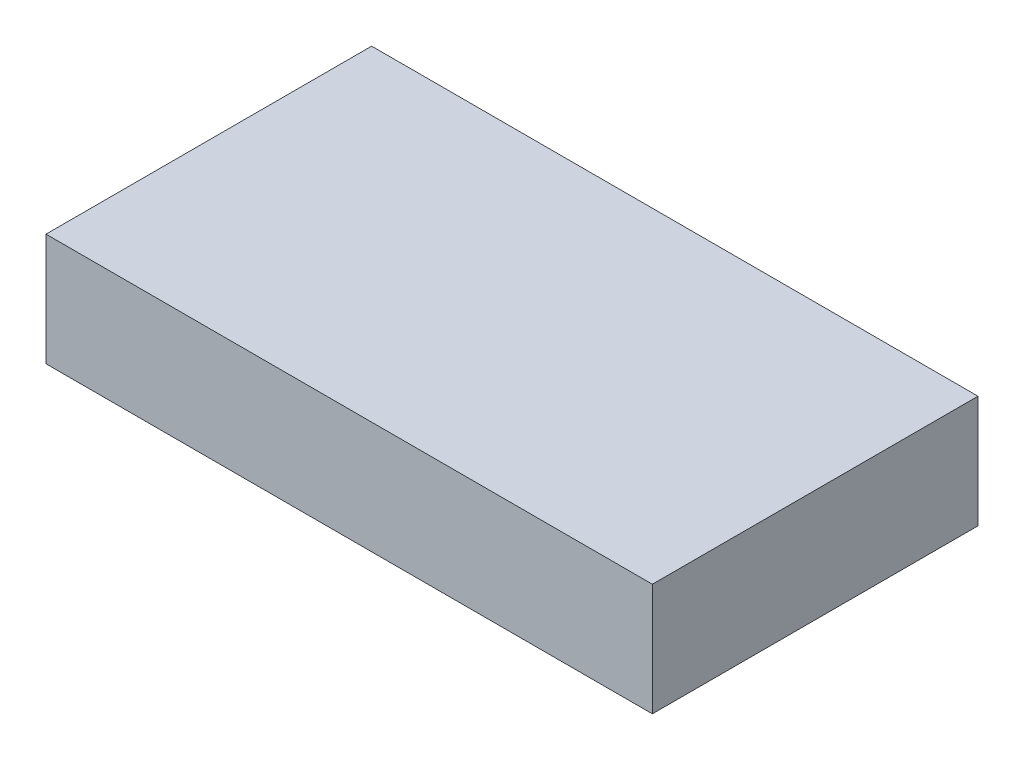
ISO-10303-21;
HEADER;
FILE_DESCRIPTION(('STEP AP214'),'2;1');
FILE_NAME('part.step','',(''),(''),'','','');
FILE_SCHEMA(('AUTOMOTIVE_DESIGN { 1 0 10303 214 1 1 1 1 }'));
ENDSEC;
DATA;
#1=APPLICATION_CONTEXT('core data for automotive mechanical design processes');
#2=APPLICATION_PROTOCOL_DEFINITION('international standard','automotive_design',2000,#1);
#3=PRODUCT_CONTEXT('',#1,'mechanical');
#4=PRODUCT('Part','Part','',(#3));
#5=PRODUCT_RELATED_PRODUCT_CATEGORY('part','',(#4));
#6=PRODUCT_DEFINITION_FORMATION('','',#4);
#7=PRODUCT_DEFINITION_CONTEXT('part definition',#1,'design');
#8=PRODUCT_DEFINITION('design','',#6,#7);
#9=PRODUCT_DEFINITION_SHAPE('','',#8);
#10=(LENGTH_UNIT() NAMED_UNIT(*) SI_UNIT(.MILLI.,.METRE.));
#11=(NAMED_UNIT(*) PLANE_ANGLE_UNIT() SI_UNIT($,.RADIAN.));
#12=(NAMED_UNIT(*) SI_UNIT($,.STERADIAN.) SOLID_ANGLE_UNIT());
#13=UNCERTAINTY_MEASURE_WITH_UNIT(LENGTH_MEASURE(1.E-05),#10,'distance_accuracy_value','');
#14=(GEOMETRIC_REPRESENTATION_CONTEXT(3) GLOBAL_UNCERTAINTY_ASSIGNED_CONTEXT((#13)) GLOBAL_UNIT_ASSIGNED_CONTEXT((#10,
#11,#12)) REPRESENTATION_CONTEXT('',''));
#15=CARTESIAN_POINT('',(0.,0.,0.));
#16=DIRECTION('',(0.,0.,1.));
#17=DIRECTION('',(1.,0.,0.));
#18=AXIS2_PLACEMENT_3D('',#15,#16,#17);
#19=CARTESIAN_POINT('',(27.,10.,-14.5));
#20=DIRECTION('',(-1.,0.,0.));
#21=DIRECTION('',(0.,0.,1.));
#22=AXIS2_PLACEMENT_3D('',#19,#20,#21);
#23=PLANE('',#22);
#24=DIRECTION('',(0.,0.,-1.));
#25=VECTOR('',#24,1.);
#26=CARTESIAN_POINT('',(27.,0.,-14.5));
#27=LINE('',#26,#25);
#28=CARTESIAN_POINT('',(27.,0.,14.5));
#29=VERTEX_POINT('',#28);
#30=CARTESIAN_POINT('',(27.,0.,-14.5));
#31=VERTEX_POINT('',#30);
#32=EDGE_CURVE('E100',#29,#31,#27,.T.);
#33=ORIENTED_EDGE('',*,*,#32,.T.);
#34=DIRECTION('',(0.,-1.,0.));
#35=VECTOR('',#34,1.);
#36=CARTESIAN_POINT('',(27.,10.,-14.5));
#37=LINE('',#36,#35);
#38=CARTESIAN_POINT('',(27.,10.,-14.5));
#39=VERTEX_POINT('',#38);
#40=EDGE_CURVE('E11',#39,#31,#37,.T.);
#41=ORIENTED_EDGE('',*,*,#40,.F.);
#42=DIRECTION('',(0.,0.,-1.));
#43=VECTOR('',#42,1.);
#44=CARTESIAN_POINT('',(27.,10.,-14.5));
#45=LINE('',#44,#43);
#46=CARTESIAN_POINT('',(27.,10.,14.5));
#47=VERTEX_POINT('',#46);
#48=EDGE_CURVE('E88',#47,#39,#45,.T.);
#49=ORIENTED_EDGE('',*,*,#48,.F.);
#50=DIRECTION('',(0.,-1.,0.));
#51=VECTOR('',#50,1.);
#52=CARTESIAN_POINT('',(27.,10.,14.5));
#53=LINE('',#52,#51);
#54=EDGE_CURVE('E96',#47,#29,#53,.T.);
#55=ORIENTED_EDGE('',*,*,#54,.T.);
#56=EDGE_LOOP('',(#33,#41,#49,#55));
#57=FACE_BOUND('',#56,.T.);
#58=ADVANCED_FACE('F37',(#57),#23,.F.);
#59=CARTESIAN_POINT('',(-27.,10.,-14.5));
#60=DIRECTION('',(0.,0.,1.));
#61=DIRECTION('',(1.,0.,0.));
#62=AXIS2_PLACEMENT_3D('',#59,#60,#61);
#63=PLANE('',#62);
#64=DIRECTION('',(-1.,0.,0.));
#65=VECTOR('',#64,1.);
#66=CARTESIAN_POINT('',(-27.,0.,-14.5));
#67=LINE('',#66,#65);
#68=CARTESIAN_POINT('',(-27.,0.,-14.5));
#69=VERTEX_POINT('',#68);
#70=EDGE_CURVE('E92',#31,#69,#67,.T.);
#71=ORIENTED_EDGE('',*,*,#70,.T.);
#72=DIRECTION('',(0.,-1.,0.));
#73=VECTOR('',#72,1.);
#74=CARTESIAN_POINT('',(-27.,10.,-14.5));
#75=LINE('',#74,#73);
#76=CARTESIAN_POINT('',(-27.,10.,-14.5));
#77=VERTEX_POINT('',#76);
#78=EDGE_CURVE('E45',#77,#69,#75,.T.);
#79=ORIENTED_EDGE('',*,*,#78,.F.);
#80=DIRECTION('',(-1.,0.,0.));
#81=VECTOR('',#80,1.);
#82=CARTESIAN_POINT('',(-27.,10.,-14.5));
#83=LINE('',#82,#81);
#84=EDGE_CURVE('E83',#39,#77,#83,.T.);
#85=ORIENTED_EDGE('',*,*,#84,.F.);
#86=ORIENTED_EDGE('',*,*,#40,.T.);
#87=EDGE_LOOP('',(#71,#79,#85,#86));
#88=FACE_BOUND('',#87,.T.);
#89=ADVANCED_FACE('F91',(#88),#63,.F.);
#90=CARTESIAN_POINT('',(-27.,10.,-14.5));
#91=DIRECTION('',(1.,0.,0.));
#92=DIRECTION('',(0.,0.,-1.));
#93=AXIS2_PLACEMENT_3D('',#90,#91,#92);
#94=PLANE('',#93);
#95=DIRECTION('',(0.,0.,1.));
#96=VECTOR('',#95,1.);
#97=CARTESIAN_POINT('',(-27.,0.,-14.5));
#98=LINE('',#97,#96);
#99=CARTESIAN_POINT('',(-27.,0.,14.5));
#100=VERTEX_POINT('',#99);
#101=EDGE_CURVE('E70',#69,#100,#98,.T.);
#102=ORIENTED_EDGE('',*,*,#101,.T.);
#103=DIRECTION('',(0.,-1.,0.));
#104=VECTOR('',#103,1.);
#105=CARTESIAN_POINT('',(-27.,10.,14.5));
#106=LINE('',#105,#104);
#107=CARTESIAN_POINT('',(-27.,10.,14.5));
#108=VERTEX_POINT('',#107);
#109=EDGE_CURVE('E93',#108,#100,#106,.T.);
#110=ORIENTED_EDGE('',*,*,#109,.F.);
#111=DIRECTION('',(0.,0.,1.));
#112=VECTOR('',#111,1.);
#113=CARTESIAN_POINT('',(-27.,10.,-14.5));
#114=LINE('',#113,#112);
#115=EDGE_CURVE('E86',#77,#108,#114,.T.);
#116=ORIENTED_EDGE('',*,*,#115,.F.);
#117=ORIENTED_EDGE('',*,*,#78,.T.);
#118=EDGE_LOOP('',(#102,#110,#116,#117));
#119=FACE_BOUND('',#118,.T.);
#120=ADVANCED_FACE('F94',(#119),#94,.F.);
#121=CARTESIAN_POINT('',(-27.,10.,14.5));
#122=DIRECTION('',(0.,0.,-1.));
#123=DIRECTION('',(-1.,0.,0.));
#124=AXIS2_PLACEMENT_3D('',#121,#122,#123);
#125=PLANE('',#124);
#126=DIRECTION('',(1.,0.,0.));
#127=VECTOR('',#126,1.);
#128=CARTESIAN_POINT('',(-27.,0.,14.5));
#129=LINE('',#128,#127);
#130=EDGE_CURVE('E76',#100,#29,#129,.T.);
#131=ORIENTED_EDGE('',*,*,#130,.T.);
#132=ORIENTED_EDGE('',*,*,#54,.F.);
#133=DIRECTION('',(1.,0.,0.));
#134=VECTOR('',#133,1.);
#135=CARTESIAN_POINT('',(-27.,10.,14.5));
#136=LINE('',#135,#134);
#137=EDGE_CURVE('E53',#108,#47,#136,.T.);
#138=ORIENTED_EDGE('',*,*,#137,.F.);
#139=ORIENTED_EDGE('',*,*,#109,.T.);
#140=EDGE_LOOP('',(#131,#132,#138,#139));
#141=FACE_BOUND('',#140,.T.);
#142=ADVANCED_FACE('F107',(#141),#125,.F.);
#143=CARTESIAN_POINT('',(0.,10.,0.));
#144=DIRECTION('',(0.,1.,0.));
#145=DIRECTION('',(0.,0.,1.));
#146=AXIS2_PLACEMENT_3D('',#143,#144,#145);
#147=PLANE('',#146);
#148=ORIENTED_EDGE('',*,*,#48,.T.);
#149=ORIENTED_EDGE('',*,*,#84,.T.);
#150=ORIENTED_EDGE('',*,*,#115,.T.);
#151=ORIENTED_EDGE('',*,*,#137,.T.);
#152=EDGE_LOOP('',(#148,#149,#150,#151));
#153=FACE_BOUND('',#152,.T.);
#154=ADVANCED_FACE('F84',(#153),#147,.T.);
#155=CARTESIAN_POINT('',(0.,0.,0.));
#156=DIRECTION('',(0.,1.,0.));
#157=DIRECTION('',(0.,0.,1.));
#158=AXIS2_PLACEMENT_3D('',#155,#156,#157);
#159=PLANE('',#158);
#160=ORIENTED_EDGE('',*,*,#32,.F.);
#161=ORIENTED_EDGE('',*,*,#130,.F.);
#162=ORIENTED_EDGE('',*,*,#101,.F.);
#163=ORIENTED_EDGE('',*,*,#70,.F.);
#164=EDGE_LOOP('',(#160,#161,#162,#163));
#165=FACE_BOUND('',#164,.T.);
#166=ADVANCED_FACE('F110',(#165),#159,.F.);
#167=CLOSED_SHELL('',(#58,#89,#120,#142,#154,#166));
#168=MANIFOLD_SOLID_BREP('B2',#167);
#169=ADVANCED_BREP_SHAPE_REPRESENTATION('',(#18,#168),#14);
#170=SHAPE_DEFINITION_REPRESENTATION(#9,#169);
ENDSEC;
END-ISO-10303-21;
